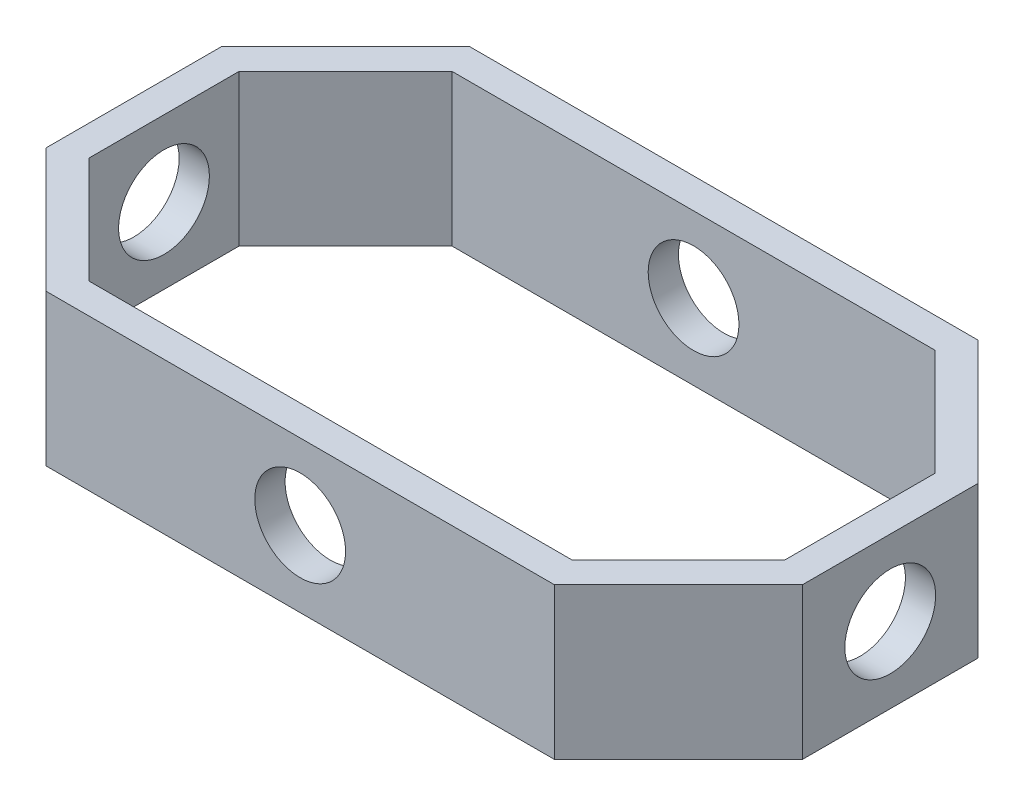
ISO-10303-21;
HEADER;
FILE_DESCRIPTION(('STEP AP214'),'2;1');
FILE_NAME('part.step','',(''),(''),'','','');
FILE_SCHEMA(('AUTOMOTIVE_DESIGN { 1 0 10303 214 1 1 1 1 }'));
ENDSEC;
DATA;
#1=APPLICATION_CONTEXT('core data for automotive mechanical design processes');
#2=APPLICATION_PROTOCOL_DEFINITION('international standard','automotive_design',2000,#1);
#3=PRODUCT_CONTEXT('',#1,'mechanical');
#4=PRODUCT('Part','Part','',(#3));
#5=PRODUCT_RELATED_PRODUCT_CATEGORY('part','',(#4));
#6=PRODUCT_DEFINITION_FORMATION('','',#4);
#7=PRODUCT_DEFINITION_CONTEXT('part definition',#1,'design');
#8=PRODUCT_DEFINITION('design','',#6,#7);
#9=PRODUCT_DEFINITION_SHAPE('','',#8);
#10=(LENGTH_UNIT() NAMED_UNIT(*) SI_UNIT(.MILLI.,.METRE.));
#11=(NAMED_UNIT(*) PLANE_ANGLE_UNIT() SI_UNIT($,.RADIAN.));
#12=(NAMED_UNIT(*) SI_UNIT($,.STERADIAN.) SOLID_ANGLE_UNIT());
#13=UNCERTAINTY_MEASURE_WITH_UNIT(LENGTH_MEASURE(1.E-05),#10,'distance_accuracy_value','');
#14=(GEOMETRIC_REPRESENTATION_CONTEXT(3) GLOBAL_UNCERTAINTY_ASSIGNED_CONTEXT((#13)) GLOBAL_UNIT_ASSIGNED_CONTEXT((#10,
#11,#12)) REPRESENTATION_CONTEXT('',''));
#15=CARTESIAN_POINT('',(0.,0.,0.));
#16=DIRECTION('',(0.,0.,1.));
#17=DIRECTION('',(1.,0.,0.));
#18=AXIS2_PLACEMENT_3D('',#15,#16,#17);
#19=CARTESIAN_POINT('',(0.,10.,0.));
#20=DIRECTION('',(0.,1.,0.));
#21=DIRECTION('',(0.,0.,1.));
#22=AXIS2_PLACEMENT_3D('',#19,#20,#21);
#23=PLANE('',#22);
#24=DIRECTION('',(-0.707106781186547,0.,0.707106781186548));
#25=VECTOR('',#24,1.);
#26=CARTESIAN_POINT('',(-16.7989898732233,10.,-14.));
#27=LINE('',#26,#25);
#28=CARTESIAN_POINT('',(-16.7989898732233,10.,-14.));
#29=VERTEX_POINT('',#28);
#30=CARTESIAN_POINT('',(-25.,10.,-5.79898987322331));
#31=VERTEX_POINT('',#30);
#32=EDGE_CURVE('E244',#29,#31,#27,.T.);
#33=ORIENTED_EDGE('',*,*,#32,.T.);
#34=DIRECTION('',(0.,0.,1.));
#35=VECTOR('',#34,1.);
#36=CARTESIAN_POINT('',(-25.,10.,-5.79898987322331));
#37=LINE('',#36,#35);
#38=CARTESIAN_POINT('',(-25.,10.,5.79898987322336));
#39=VERTEX_POINT('',#38);
#40=EDGE_CURVE('E248',#31,#39,#37,.T.);
#41=ORIENTED_EDGE('',*,*,#40,.T.);
#42=DIRECTION('',(0.707106781186548,0.,0.707106781186547));
#43=VECTOR('',#42,1.);
#44=CARTESIAN_POINT('',(-25.,10.,5.79898987322336));
#45=LINE('',#44,#43);
#46=CARTESIAN_POINT('',(-16.7989898732233,10.,14.));
#47=VERTEX_POINT('',#46);
#48=EDGE_CURVE('E252',#39,#47,#45,.T.);
#49=ORIENTED_EDGE('',*,*,#48,.T.);
#50=DIRECTION('',(1.,0.,0.));
#51=VECTOR('',#50,1.);
#52=CARTESIAN_POINT('',(-16.7989898732233,10.,14.));
#53=LINE('',#52,#51);
#54=CARTESIAN_POINT('',(16.7989898732233,10.,14.));
#55=VERTEX_POINT('',#54);
#56=EDGE_CURVE('E255',#47,#55,#53,.T.);
#57=ORIENTED_EDGE('',*,*,#56,.T.);
#58=DIRECTION('',(0.707106781186546,0.,-0.707106781186548));
#59=VECTOR('',#58,1.);
#60=CARTESIAN_POINT('',(16.7989898732233,10.,14.));
#61=LINE('',#60,#59);
#62=CARTESIAN_POINT('',(25.,10.,5.79898987322331));
#63=VERTEX_POINT('',#62);
#64=EDGE_CURVE('E258',#55,#63,#61,.T.);
#65=ORIENTED_EDGE('',*,*,#64,.T.);
#66=DIRECTION('',(0.,0.,-1.));
#67=VECTOR('',#66,1.);
#68=CARTESIAN_POINT('',(25.,10.,5.79898987322331));
#69=LINE('',#68,#67);
#70=CARTESIAN_POINT('',(25.,10.,-5.79898987322333));
#71=VERTEX_POINT('',#70);
#72=EDGE_CURVE('E261',#63,#71,#69,.T.);
#73=ORIENTED_EDGE('',*,*,#72,.T.);
#74=DIRECTION('',(-0.707106781186549,0.,-0.707106781186547));
#75=VECTOR('',#74,1.);
#76=CARTESIAN_POINT('',(25.,10.,-5.79898987322333));
#77=LINE('',#76,#75);
#78=CARTESIAN_POINT('',(16.7989898732233,10.,-14.));
#79=VERTEX_POINT('',#78);
#80=EDGE_CURVE('E264',#71,#79,#77,.T.);
#81=ORIENTED_EDGE('',*,*,#80,.T.);
#82=DIRECTION('',(-1.,0.,0.));
#83=VECTOR('',#82,1.);
#84=CARTESIAN_POINT('',(16.7989898732233,10.,-14.));
#85=LINE('',#84,#83);
#86=EDGE_CURVE('E267',#79,#29,#85,.T.);
#87=ORIENTED_EDGE('',*,*,#86,.T.);
#88=EDGE_LOOP('',(#33,#41,#49,#57,#65,#73,#81,#87));
#89=FACE_BOUND('',#88,.T.);
#90=DIRECTION('',(0.707106781186548,0.,0.707106781186548));
#91=VECTOR('',#90,1.);
#92=CARTESIAN_POINT('',(-23.,10.,4.97056274847715));
#93=LINE('',#92,#91);
#94=CARTESIAN_POINT('',(-23.,10.,4.97056274847715));
#95=VERTEX_POINT('',#94);
#96=CARTESIAN_POINT('',(-15.9705627484772,10.,12.));
#97=VERTEX_POINT('',#96);
#98=EDGE_CURVE('E162',#95,#97,#93,.T.);
#99=ORIENTED_EDGE('',*,*,#98,.F.);
#100=DIRECTION('',(0.,0.,1.));
#101=VECTOR('',#100,1.);
#102=CARTESIAN_POINT('',(-23.,10.,-4.97056274847714));
#103=LINE('',#102,#101);
#104=CARTESIAN_POINT('',(-23.,10.,-4.97056274847714));
#105=VERTEX_POINT('',#104);
#106=EDGE_CURVE('E153',#105,#95,#103,.T.);
#107=ORIENTED_EDGE('',*,*,#106,.F.);
#108=DIRECTION('',(-0.707106781186548,0.,0.707106781186548));
#109=VECTOR('',#108,1.);
#110=CARTESIAN_POINT('',(-15.9705627484771,10.,-12.));
#111=LINE('',#110,#109);
#112=CARTESIAN_POINT('',(-15.9705627484771,10.,-12.));
#113=VERTEX_POINT('',#112);
#114=EDGE_CURVE('E195',#113,#105,#111,.T.);
#115=ORIENTED_EDGE('',*,*,#114,.F.);
#116=DIRECTION('',(-1.,0.,0.));
#117=VECTOR('',#116,1.);
#118=CARTESIAN_POINT('',(15.9705627484771,10.,-12.));
#119=LINE('',#118,#117);
#120=CARTESIAN_POINT('',(15.9705627484771,10.,-12.));
#121=VERTEX_POINT('',#120);
#122=EDGE_CURVE('E192',#121,#113,#119,.T.);
#123=ORIENTED_EDGE('',*,*,#122,.F.);
#124=DIRECTION('',(-0.707106781186548,0.,-0.707106781186548));
#125=VECTOR('',#124,1.);
#126=CARTESIAN_POINT('',(23.,10.,-4.97056274847714));
#127=LINE('',#126,#125);
#128=CARTESIAN_POINT('',(23.,10.,-4.97056274847714));
#129=VERTEX_POINT('',#128);
#130=EDGE_CURVE('E189',#129,#121,#127,.T.);
#131=ORIENTED_EDGE('',*,*,#130,.F.);
#132=DIRECTION('',(0.,0.,-1.));
#133=VECTOR('',#132,1.);
#134=CARTESIAN_POINT('',(23.,10.,4.97056274847714));
#135=LINE('',#134,#133);
#136=CARTESIAN_POINT('',(23.,10.,4.97056274847714));
#137=VERTEX_POINT('',#136);
#138=EDGE_CURVE('E186',#137,#129,#135,.T.);
#139=ORIENTED_EDGE('',*,*,#138,.F.);
#140=DIRECTION('',(0.707106781186548,0.,-0.707106781186548));
#141=VECTOR('',#140,1.);
#142=CARTESIAN_POINT('',(15.9705627484771,10.,12.));
#143=LINE('',#142,#141);
#144=CARTESIAN_POINT('',(15.9705627484771,10.,12.));
#145=VERTEX_POINT('',#144);
#146=EDGE_CURVE('E180',#145,#137,#143,.T.);
#147=ORIENTED_EDGE('',*,*,#146,.F.);
#148=DIRECTION('',(1.,0.,0.));
#149=VECTOR('',#148,1.);
#150=CARTESIAN_POINT('',(-15.9705627484772,10.,12.));
#151=LINE('',#150,#149);
#152=EDGE_CURVE('E176',#97,#145,#151,.T.);
#153=ORIENTED_EDGE('',*,*,#152,.F.);
#154=EDGE_LOOP('',(#99,#107,#115,#123,#131,#139,#147,#153));
#155=FACE_BOUND('',#154,.T.);
#156=ADVANCED_FACE('F39',(#89,#155),#23,.T.);
#157=CARTESIAN_POINT('',(0.,0.,0.));
#158=DIRECTION('',(0.,1.,0.));
#159=DIRECTION('',(0.,0.,1.));
#160=AXIS2_PLACEMENT_3D('',#157,#158,#159);
#161=PLANE('',#160);
#162=DIRECTION('',(-0.707106781186547,0.,0.707106781186548));
#163=VECTOR('',#162,1.);
#164=CARTESIAN_POINT('',(-16.7989898732233,0.,-14.));
#165=LINE('',#164,#163);
#166=CARTESIAN_POINT('',(-16.7989898732233,0.,-14.));
#167=VERTEX_POINT('',#166);
#168=CARTESIAN_POINT('',(-25.,0.,-5.79898987322331));
#169=VERTEX_POINT('',#168);
#170=EDGE_CURVE('E171',#167,#169,#165,.T.);
#171=ORIENTED_EDGE('',*,*,#170,.F.);
#172=DIRECTION('',(-1.,0.,0.));
#173=VECTOR('',#172,1.);
#174=CARTESIAN_POINT('',(16.7989898732233,0.,-14.));
#175=LINE('',#174,#173);
#176=CARTESIAN_POINT('',(16.7989898732233,0.,-14.));
#177=VERTEX_POINT('',#176);
#178=EDGE_CURVE('E249',#177,#167,#175,.T.);
#179=ORIENTED_EDGE('',*,*,#178,.F.);
#180=DIRECTION('',(-0.707106781186549,0.,-0.707106781186547));
#181=VECTOR('',#180,1.);
#182=CARTESIAN_POINT('',(25.,0.,-5.79898987322333));
#183=LINE('',#182,#181);
#184=CARTESIAN_POINT('',(25.,0.,-5.79898987322333));
#185=VERTEX_POINT('',#184);
#186=EDGE_CURVE('E289',#185,#177,#183,.T.);
#187=ORIENTED_EDGE('',*,*,#186,.F.);
#188=DIRECTION('',(0.,0.,-1.));
#189=VECTOR('',#188,1.);
#190=CARTESIAN_POINT('',(25.,0.,5.79898987322331));
#191=LINE('',#190,#189);
#192=CARTESIAN_POINT('',(25.,0.,5.79898987322331));
#193=VERTEX_POINT('',#192);
#194=EDGE_CURVE('E286',#193,#185,#191,.T.);
#195=ORIENTED_EDGE('',*,*,#194,.F.);
#196=DIRECTION('',(0.707106781186546,0.,-0.707106781186548));
#197=VECTOR('',#196,1.);
#198=CARTESIAN_POINT('',(16.7989898732233,0.,14.));
#199=LINE('',#198,#197);
#200=CARTESIAN_POINT('',(16.7989898732233,0.,14.));
#201=VERTEX_POINT('',#200);
#202=EDGE_CURVE('E283',#201,#193,#199,.T.);
#203=ORIENTED_EDGE('',*,*,#202,.F.);
#204=DIRECTION('',(1.,0.,0.));
#205=VECTOR('',#204,1.);
#206=CARTESIAN_POINT('',(-16.7989898732233,0.,14.));
#207=LINE('',#206,#205);
#208=CARTESIAN_POINT('',(-16.7989898732233,0.,14.));
#209=VERTEX_POINT('',#208);
#210=EDGE_CURVE('E280',#209,#201,#207,.T.);
#211=ORIENTED_EDGE('',*,*,#210,.F.);
#212=DIRECTION('',(0.707106781186548,0.,0.707106781186547));
#213=VECTOR('',#212,1.);
#214=CARTESIAN_POINT('',(-25.,0.,5.79898987322336));
#215=LINE('',#214,#213);
#216=CARTESIAN_POINT('',(-25.,0.,5.79898987322336));
#217=VERTEX_POINT('',#216);
#218=EDGE_CURVE('E277',#217,#209,#215,.T.);
#219=ORIENTED_EDGE('',*,*,#218,.F.);
#220=DIRECTION('',(0.,0.,1.));
#221=VECTOR('',#220,1.);
#222=CARTESIAN_POINT('',(-25.,0.,-5.79898987322331));
#223=LINE('',#222,#221);
#224=EDGE_CURVE('E274',#169,#217,#223,.T.);
#225=ORIENTED_EDGE('',*,*,#224,.F.);
#226=EDGE_LOOP('',(#171,#179,#187,#195,#203,#211,#219,#225));
#227=FACE_BOUND('',#226,.T.);
#228=DIRECTION('',(0.,0.,1.));
#229=VECTOR('',#228,1.);
#230=CARTESIAN_POINT('',(-23.,0.,-4.97056274847714));
#231=LINE('',#230,#229);
#232=CARTESIAN_POINT('',(-23.,0.,-4.97056274847714));
#233=VERTEX_POINT('',#232);
#234=CARTESIAN_POINT('',(-23.,0.,4.97056274847715));
#235=VERTEX_POINT('',#234);
#236=EDGE_CURVE('E63',#233,#235,#231,.T.);
#237=ORIENTED_EDGE('',*,*,#236,.T.);
#238=DIRECTION('',(0.707106781186548,0.,0.707106781186548));
#239=VECTOR('',#238,1.);
#240=CARTESIAN_POINT('',(-23.,0.,4.97056274847715));
#241=LINE('',#240,#239);
#242=CARTESIAN_POINT('',(-15.9705627484772,0.,12.));
#243=VERTEX_POINT('',#242);
#244=EDGE_CURVE('E169',#235,#243,#241,.T.);
#245=ORIENTED_EDGE('',*,*,#244,.T.);
#246=DIRECTION('',(1.,0.,0.));
#247=VECTOR('',#246,1.);
#248=CARTESIAN_POINT('',(-15.9705627484772,0.,12.));
#249=LINE('',#248,#247);
#250=CARTESIAN_POINT('',(15.9705627484771,0.,12.));
#251=VERTEX_POINT('',#250);
#252=EDGE_CURVE('E203',#243,#251,#249,.T.);
#253=ORIENTED_EDGE('',*,*,#252,.T.);
#254=DIRECTION('',(0.707106781186548,0.,-0.707106781186548));
#255=VECTOR('',#254,1.);
#256=CARTESIAN_POINT('',(15.9705627484771,0.,12.));
#257=LINE('',#256,#255);
#258=CARTESIAN_POINT('',(23.,0.,4.97056274847714));
#259=VERTEX_POINT('',#258);
#260=EDGE_CURVE('E207',#251,#259,#257,.T.);
#261=ORIENTED_EDGE('',*,*,#260,.T.);
#262=DIRECTION('',(0.,0.,-1.));
#263=VECTOR('',#262,1.);
#264=CARTESIAN_POINT('',(23.,0.,4.97056274847714));
#265=LINE('',#264,#263);
#266=CARTESIAN_POINT('',(23.,0.,-4.97056274847714));
#267=VERTEX_POINT('',#266);
#268=EDGE_CURVE('E211',#259,#267,#265,.T.);
#269=ORIENTED_EDGE('',*,*,#268,.T.);
#270=DIRECTION('',(-0.707106781186548,0.,-0.707106781186548));
#271=VECTOR('',#270,1.);
#272=CARTESIAN_POINT('',(23.,0.,-4.97056274847714));
#273=LINE('',#272,#271);
#274=CARTESIAN_POINT('',(15.9705627484771,0.,-12.));
#275=VERTEX_POINT('',#274);
#276=EDGE_CURVE('E215',#267,#275,#273,.T.);
#277=ORIENTED_EDGE('',*,*,#276,.T.);
#278=DIRECTION('',(-1.,0.,0.));
#279=VECTOR('',#278,1.);
#280=CARTESIAN_POINT('',(15.9705627484771,0.,-12.));
#281=LINE('',#280,#279);
#282=CARTESIAN_POINT('',(-15.9705627484771,0.,-12.));
#283=VERTEX_POINT('',#282);
#284=EDGE_CURVE('E219',#275,#283,#281,.T.);
#285=ORIENTED_EDGE('',*,*,#284,.T.);
#286=DIRECTION('',(-0.707106781186548,0.,0.707106781186548));
#287=VECTOR('',#286,1.);
#288=CARTESIAN_POINT('',(-15.9705627484771,0.,-12.));
#289=LINE('',#288,#287);
#290=EDGE_CURVE('E163',#283,#233,#289,.T.);
#291=ORIENTED_EDGE('',*,*,#290,.T.);
#292=EDGE_LOOP('',(#237,#245,#253,#261,#269,#277,#285,#291));
#293=FACE_BOUND('',#292,.T.);
#294=ADVANCED_FACE('F328',(#227,#293),#161,.F.);
#295=CARTESIAN_POINT('',(-16.7989898732233,10.,-14.));
#296=DIRECTION('',(0.707106781186548,0.,0.707106781186547));
#297=DIRECTION('',(0.707106781186547,0.,-0.707106781186548));
#298=AXIS2_PLACEMENT_3D('',#295,#296,#297);
#299=PLANE('',#298);
#300=ORIENTED_EDGE('',*,*,#170,.T.);
#301=DIRECTION('',(0.,-1.,0.));
#302=VECTOR('',#301,1.);
#303=CARTESIAN_POINT('',(-25.,10.,-5.79898987322331));
#304=LINE('',#303,#302);
#305=EDGE_CURVE('E11',#31,#169,#304,.T.);
#306=ORIENTED_EDGE('',*,*,#305,.F.);
#307=ORIENTED_EDGE('',*,*,#32,.F.);
#308=DIRECTION('',(0.,-1.,0.));
#309=VECTOR('',#308,1.);
#310=CARTESIAN_POINT('',(-16.7989898732233,10.,-14.));
#311=LINE('',#310,#309);
#312=EDGE_CURVE('E270',#29,#167,#311,.T.);
#313=ORIENTED_EDGE('',*,*,#312,.T.);
#314=EDGE_LOOP('',(#300,#306,#307,#313));
#315=FACE_BOUND('',#314,.T.);
#316=ADVANCED_FACE('F41',(#315),#299,.F.);
#317=CARTESIAN_POINT('',(-25.,10.,-5.79898987322331));
#318=DIRECTION('',(1.,0.,0.));
#319=DIRECTION('',(0.,0.,-1.));
#320=AXIS2_PLACEMENT_3D('',#317,#318,#319);
#321=PLANE('',#320);
#322=CARTESIAN_POINT('',(-25.,5.,0.));
#323=DIRECTION('',(1.,0.,0.));
#324=DIRECTION('',(0.,0.,-1.));
#325=AXIS2_PLACEMENT_3D('',#322,#323,#324);
#326=CIRCLE('',#325,3.);
#327=CARTESIAN_POINT('',(-25.,5.,-2.99999999999991));
#328=VERTEX_POINT('',#327);
#329=EDGE_CURVE('E395',#328,#328,#326,.F.);
#330=ORIENTED_EDGE('',*,*,#329,.F.);
#331=EDGE_LOOP('',(#330));
#332=FACE_BOUND('',#331,.T.);
#333=ORIENTED_EDGE('',*,*,#224,.T.);
#334=DIRECTION('',(0.,-1.,0.));
#335=VECTOR('',#334,1.);
#336=CARTESIAN_POINT('',(-25.,10.,5.79898987322336));
#337=LINE('',#336,#335);
#338=EDGE_CURVE('E48',#39,#217,#337,.T.);
#339=ORIENTED_EDGE('',*,*,#338,.F.);
#340=ORIENTED_EDGE('',*,*,#40,.F.);
#341=ORIENTED_EDGE('',*,*,#305,.T.);
#342=EDGE_LOOP('',(#333,#339,#340,#341));
#343=FACE_BOUND('',#342,.T.);
#344=ADVANCED_FACE('F345',(#332,#343),#321,.F.);
#345=CARTESIAN_POINT('',(-25.,10.,5.79898987322336));
#346=DIRECTION('',(0.707106781186547,0.,-0.707106781186548));
#347=DIRECTION('',(-0.707106781186548,0.,-0.707106781186547));
#348=AXIS2_PLACEMENT_3D('',#345,#346,#347);
#349=PLANE('',#348);
#350=ORIENTED_EDGE('',*,*,#218,.T.);
#351=DIRECTION('',(0.,-1.,0.));
#352=VECTOR('',#351,1.);
#353=CARTESIAN_POINT('',(-16.7989898732233,10.,14.));
#354=LINE('',#353,#352);
#355=EDGE_CURVE('E313',#47,#209,#354,.T.);
#356=ORIENTED_EDGE('',*,*,#355,.F.);
#357=ORIENTED_EDGE('',*,*,#48,.F.);
#358=ORIENTED_EDGE('',*,*,#338,.T.);
#359=EDGE_LOOP('',(#350,#356,#357,#358));
#360=FACE_BOUND('',#359,.T.);
#361=ADVANCED_FACE('F322',(#360),#349,.F.);
#362=CARTESIAN_POINT('',(-16.7989898732233,10.,14.));
#363=DIRECTION('',(0.,0.,-1.));
#364=DIRECTION('',(-1.,0.,0.));
#365=AXIS2_PLACEMENT_3D('',#362,#363,#364);
#366=PLANE('',#365);
#367=CARTESIAN_POINT('',(0.,5.,14.));
#368=DIRECTION('',(0.,0.,1.));
#369=DIRECTION('',(1.,0.,0.));
#370=AXIS2_PLACEMENT_3D('',#367,#368,#369);
#371=CIRCLE('',#370,3.);
#372=CARTESIAN_POINT('',(3.,5.,14.));
#373=VERTEX_POINT('',#372);
#374=EDGE_CURVE('E200',#373,#373,#371,.T.);
#375=ORIENTED_EDGE('',*,*,#374,.F.);
#376=EDGE_LOOP('',(#375));
#377=FACE_BOUND('',#376,.T.);
#378=ORIENTED_EDGE('',*,*,#210,.T.);
#379=DIRECTION('',(0.,-1.,0.));
#380=VECTOR('',#379,1.);
#381=CARTESIAN_POINT('',(16.7989898732233,10.,14.));
#382=LINE('',#381,#380);
#383=EDGE_CURVE('E309',#55,#201,#382,.T.);
#384=ORIENTED_EDGE('',*,*,#383,.F.);
#385=ORIENTED_EDGE('',*,*,#56,.F.);
#386=ORIENTED_EDGE('',*,*,#355,.T.);
#387=EDGE_LOOP('',(#378,#384,#385,#386));
#388=FACE_BOUND('',#387,.T.);
#389=ADVANCED_FACE('F334',(#377,#388),#366,.F.);
#390=CARTESIAN_POINT('',(16.7989898732233,10.,14.));
#391=DIRECTION('',(-0.707106781186548,0.,-0.707106781186546));
#392=DIRECTION('',(-0.707106781186547,0.,0.707106781186549));
#393=AXIS2_PLACEMENT_3D('',#390,#391,#392);
#394=PLANE('',#393);
#395=ORIENTED_EDGE('',*,*,#202,.T.);
#396=DIRECTION('',(0.,-1.,0.));
#397=VECTOR('',#396,1.);
#398=CARTESIAN_POINT('',(25.,10.,5.79898987322331));
#399=LINE('',#398,#397);
#400=EDGE_CURVE('E305',#63,#193,#399,.T.);
#401=ORIENTED_EDGE('',*,*,#400,.F.);
#402=ORIENTED_EDGE('',*,*,#64,.F.);
#403=ORIENTED_EDGE('',*,*,#383,.T.);
#404=EDGE_LOOP('',(#395,#401,#402,#403));
#405=FACE_BOUND('',#404,.T.);
#406=ADVANCED_FACE('F338',(#405),#394,.F.);
#407=CARTESIAN_POINT('',(25.,10.,5.79898987322331));
#408=DIRECTION('',(-1.,0.,0.));
#409=DIRECTION('',(0.,0.,1.));
#410=AXIS2_PLACEMENT_3D('',#407,#408,#409);
#411=PLANE('',#410);
#412=CARTESIAN_POINT('',(25.,5.,-2.61861100413235E-13));
#413=DIRECTION('',(-1.,0.,0.));
#414=DIRECTION('',(0.,0.,1.));
#415=AXIS2_PLACEMENT_3D('',#412,#413,#414);
#416=CIRCLE('',#415,3.);
#417=CARTESIAN_POINT('',(25.,5.,2.99999999999974));
#418=VERTEX_POINT('',#417);
#419=EDGE_CURVE('E398',#418,#418,#416,.F.);
#420=ORIENTED_EDGE('',*,*,#419,.F.);
#421=EDGE_LOOP('',(#420));
#422=FACE_BOUND('',#421,.T.);
#423=ORIENTED_EDGE('',*,*,#194,.T.);
#424=DIRECTION('',(0.,-1.,0.));
#425=VECTOR('',#424,1.);
#426=CARTESIAN_POINT('',(25.,10.,-5.79898987322333));
#427=LINE('',#426,#425);
#428=EDGE_CURVE('E301',#71,#185,#427,.T.);
#429=ORIENTED_EDGE('',*,*,#428,.F.);
#430=ORIENTED_EDGE('',*,*,#72,.F.);
#431=ORIENTED_EDGE('',*,*,#400,.T.);
#432=EDGE_LOOP('',(#423,#429,#430,#431));
#433=FACE_BOUND('',#432,.T.);
#434=ADVANCED_FACE('F358',(#422,#433),#411,.F.);
#435=CARTESIAN_POINT('',(25.,10.,-5.79898987322333));
#436=DIRECTION('',(-0.707106781186547,0.,0.707106781186548));
#437=DIRECTION('',(0.707106781186548,0.,0.707106781186547));
#438=AXIS2_PLACEMENT_3D('',#435,#436,#437);
#439=PLANE('',#438);
#440=ORIENTED_EDGE('',*,*,#186,.T.);
#441=DIRECTION('',(0.,-1.,0.));
#442=VECTOR('',#441,1.);
#443=CARTESIAN_POINT('',(16.7989898732233,10.,-14.));
#444=LINE('',#443,#442);
#445=EDGE_CURVE('E297',#79,#177,#444,.T.);
#446=ORIENTED_EDGE('',*,*,#445,.F.);
#447=ORIENTED_EDGE('',*,*,#80,.F.);
#448=ORIENTED_EDGE('',*,*,#428,.T.);
#449=EDGE_LOOP('',(#440,#446,#447,#448));
#450=FACE_BOUND('',#449,.T.);
#451=ADVANCED_FACE('F356',(#450),#439,.F.);
#452=CARTESIAN_POINT('',(16.7989898732233,10.,-14.));
#453=DIRECTION('',(0.,0.,1.));
#454=DIRECTION('',(1.,0.,0.));
#455=AXIS2_PLACEMENT_3D('',#452,#453,#454);
#456=PLANE('',#455);
#457=CARTESIAN_POINT('',(0.,5.,-14.));
#458=DIRECTION('',(0.,0.,-1.));
#459=DIRECTION('',(-1.,0.,0.));
#460=AXIS2_PLACEMENT_3D('',#457,#458,#459);
#461=CIRCLE('',#460,3.);
#462=CARTESIAN_POINT('',(-3.,5.,-14.));
#463=VERTEX_POINT('',#462);
#464=EDGE_CURVE('E386',#463,#463,#461,.T.);
#465=ORIENTED_EDGE('',*,*,#464,.F.);
#466=EDGE_LOOP('',(#465));
#467=FACE_BOUND('',#466,.T.);
#468=ORIENTED_EDGE('',*,*,#178,.T.);
#469=ORIENTED_EDGE('',*,*,#312,.F.);
#470=ORIENTED_EDGE('',*,*,#86,.F.);
#471=ORIENTED_EDGE('',*,*,#445,.T.);
#472=EDGE_LOOP('',(#468,#469,#470,#471));
#473=FACE_BOUND('',#472,.T.);
#474=ADVANCED_FACE('F351',(#467,#473),#456,.F.);
#475=CARTESIAN_POINT('',(-23.,10.,-4.97056274847714));
#476=DIRECTION('',(1.,0.,0.));
#477=DIRECTION('',(0.,0.,-1.));
#478=AXIS2_PLACEMENT_3D('',#475,#476,#477);
#479=PLANE('',#478);
#480=CARTESIAN_POINT('',(-23.,5.,0.));
#481=DIRECTION('',(1.,0.,0.));
#482=DIRECTION('',(0.,0.,-1.));
#483=AXIS2_PLACEMENT_3D('',#480,#481,#482);
#484=CIRCLE('',#483,3.);
#485=CARTESIAN_POINT('',(-23.,5.,-2.99999999999992));
#486=VERTEX_POINT('',#485);
#487=EDGE_CURVE('E389',#486,#486,#484,.F.);
#488=ORIENTED_EDGE('',*,*,#487,.T.);
#489=EDGE_LOOP('',(#488));
#490=FACE_BOUND('',#489,.T.);
#491=ORIENTED_EDGE('',*,*,#236,.F.);
#492=DIRECTION('',(0.,-1.,0.));
#493=VECTOR('',#492,1.);
#494=CARTESIAN_POINT('',(-23.,10.,-4.97056274847714));
#495=LINE('',#494,#493);
#496=EDGE_CURVE('E157',#105,#233,#495,.T.);
#497=ORIENTED_EDGE('',*,*,#496,.F.);
#498=ORIENTED_EDGE('',*,*,#106,.T.);
#499=DIRECTION('',(0.,-1.,0.));
#500=VECTOR('',#499,1.);
#501=CARTESIAN_POINT('',(-23.,10.,4.97056274847715));
#502=LINE('',#501,#500);
#503=EDGE_CURVE('E156',#95,#235,#502,.T.);
#504=ORIENTED_EDGE('',*,*,#503,.T.);
#505=EDGE_LOOP('',(#491,#497,#498,#504));
#506=FACE_BOUND('',#505,.T.);
#507=ADVANCED_FACE('F155',(#490,#506),#479,.T.);
#508=CARTESIAN_POINT('',(-23.,10.,4.97056274847715));
#509=DIRECTION('',(0.707106781186548,0.,-0.707106781186548));
#510=DIRECTION('',(-0.707106781186548,0.,-0.707106781186548));
#511=AXIS2_PLACEMENT_3D('',#508,#509,#510);
#512=PLANE('',#511);
#513=ORIENTED_EDGE('',*,*,#244,.F.);
#514=ORIENTED_EDGE('',*,*,#503,.F.);
#515=ORIENTED_EDGE('',*,*,#98,.T.);
#516=DIRECTION('',(0.,-1.,0.));
#517=VECTOR('',#516,1.);
#518=CARTESIAN_POINT('',(-15.9705627484772,10.,12.));
#519=LINE('',#518,#517);
#520=EDGE_CURVE('E172',#97,#243,#519,.T.);
#521=ORIENTED_EDGE('',*,*,#520,.T.);
#522=EDGE_LOOP('',(#513,#514,#515,#521));
#523=FACE_BOUND('',#522,.T.);
#524=ADVANCED_FACE('F166',(#523),#512,.T.);
#525=CARTESIAN_POINT('',(-15.9705627484772,10.,12.));
#526=DIRECTION('',(0.,0.,-1.));
#527=DIRECTION('',(-1.,0.,0.));
#528=AXIS2_PLACEMENT_3D('',#525,#526,#527);
#529=PLANE('',#528);
#530=CARTESIAN_POINT('',(0.,5.,12.));
#531=DIRECTION('',(0.,0.,-1.));
#532=DIRECTION('',(-1.,0.,0.));
#533=AXIS2_PLACEMENT_3D('',#530,#531,#532);
#534=CIRCLE('',#533,3.);
#535=CARTESIAN_POINT('',(-3.,5.,12.));
#536=VERTEX_POINT('',#535);
#537=EDGE_CURVE('E409',#536,#536,#534,.F.);
#538=ORIENTED_EDGE('',*,*,#537,.T.);
#539=EDGE_LOOP('',(#538));
#540=FACE_BOUND('',#539,.T.);
#541=ORIENTED_EDGE('',*,*,#252,.F.);
#542=ORIENTED_EDGE('',*,*,#520,.F.);
#543=ORIENTED_EDGE('',*,*,#152,.T.);
#544=DIRECTION('',(0.,-1.,0.));
#545=VECTOR('',#544,1.);
#546=CARTESIAN_POINT('',(15.9705627484771,10.,12.));
#547=LINE('',#546,#545);
#548=EDGE_CURVE('E239',#145,#251,#547,.T.);
#549=ORIENTED_EDGE('',*,*,#548,.T.);
#550=EDGE_LOOP('',(#541,#542,#543,#549));
#551=FACE_BOUND('',#550,.T.);
#552=ADVANCED_FACE('F470',(#540,#551),#529,.T.);
#553=CARTESIAN_POINT('',(15.9705627484771,10.,12.));
#554=DIRECTION('',(-0.707106781186548,0.,-0.707106781186548));
#555=DIRECTION('',(-0.707106781186548,0.,0.707106781186548));
#556=AXIS2_PLACEMENT_3D('',#553,#554,#555);
#557=PLANE('',#556);
#558=ORIENTED_EDGE('',*,*,#260,.F.);
#559=ORIENTED_EDGE('',*,*,#548,.F.);
#560=ORIENTED_EDGE('',*,*,#146,.T.);
#561=DIRECTION('',(0.,-1.,0.));
#562=VECTOR('',#561,1.);
#563=CARTESIAN_POINT('',(23.,10.,4.97056274847714));
#564=LINE('',#563,#562);
#565=EDGE_CURVE('E236',#137,#259,#564,.T.);
#566=ORIENTED_EDGE('',*,*,#565,.T.);
#567=EDGE_LOOP('',(#558,#559,#560,#566));
#568=FACE_BOUND('',#567,.T.);
#569=ADVANCED_FACE('F466',(#568),#557,.T.);
#570=CARTESIAN_POINT('',(23.,10.,4.97056274847714));
#571=DIRECTION('',(-1.,0.,0.));
#572=DIRECTION('',(0.,0.,1.));
#573=AXIS2_PLACEMENT_3D('',#570,#571,#572);
#574=PLANE('',#573);
#575=CARTESIAN_POINT('',(23.,5.,-2.40912212380176E-13));
#576=DIRECTION('',(-1.,0.,0.));
#577=DIRECTION('',(0.,0.,1.));
#578=AXIS2_PLACEMENT_3D('',#575,#576,#577);
#579=CIRCLE('',#578,3.);
#580=CARTESIAN_POINT('',(23.,5.,2.99999999999976));
#581=VERTEX_POINT('',#580);
#582=EDGE_CURVE('E402',#581,#581,#579,.F.);
#583=ORIENTED_EDGE('',*,*,#582,.T.);
#584=EDGE_LOOP('',(#583));
#585=FACE_BOUND('',#584,.T.);
#586=ORIENTED_EDGE('',*,*,#268,.F.);
#587=ORIENTED_EDGE('',*,*,#565,.F.);
#588=ORIENTED_EDGE('',*,*,#138,.T.);
#589=DIRECTION('',(0.,-1.,0.));
#590=VECTOR('',#589,1.);
#591=CARTESIAN_POINT('',(23.,10.,-4.97056274847714));
#592=LINE('',#591,#590);
#593=EDGE_CURVE('E233',#129,#267,#592,.T.);
#594=ORIENTED_EDGE('',*,*,#593,.T.);
#595=EDGE_LOOP('',(#586,#587,#588,#594));
#596=FACE_BOUND('',#595,.T.);
#597=ADVANCED_FACE('F462',(#585,#596),#574,.T.);
#598=CARTESIAN_POINT('',(23.,10.,-4.97056274847714));
#599=DIRECTION('',(-0.707106781186548,0.,0.707106781186548));
#600=DIRECTION('',(0.707106781186548,0.,0.707106781186548));
#601=AXIS2_PLACEMENT_3D('',#598,#599,#600);
#602=PLANE('',#601);
#603=ORIENTED_EDGE('',*,*,#276,.F.);
#604=ORIENTED_EDGE('',*,*,#593,.F.);
#605=ORIENTED_EDGE('',*,*,#130,.T.);
#606=DIRECTION('',(0.,-1.,0.));
#607=VECTOR('',#606,1.);
#608=CARTESIAN_POINT('',(15.9705627484771,10.,-12.));
#609=LINE('',#608,#607);
#610=EDGE_CURVE('E230',#121,#275,#609,.T.);
#611=ORIENTED_EDGE('',*,*,#610,.T.);
#612=EDGE_LOOP('',(#603,#604,#605,#611));
#613=FACE_BOUND('',#612,.T.);
#614=ADVANCED_FACE('F458',(#613),#602,.T.);
#615=CARTESIAN_POINT('',(15.9705627484771,10.,-12.));
#616=DIRECTION('',(0.,0.,1.));
#617=DIRECTION('',(1.,0.,0.));
#618=AXIS2_PLACEMENT_3D('',#615,#616,#617);
#619=PLANE('',#618);
#620=CARTESIAN_POINT('',(0.,5.,-12.));
#621=DIRECTION('',(0.,0.,1.));
#622=DIRECTION('',(1.,0.,0.));
#623=AXIS2_PLACEMENT_3D('',#620,#621,#622);
#624=CIRCLE('',#623,3.);
#625=CARTESIAN_POINT('',(3.,5.,-12.));
#626=VERTEX_POINT('',#625);
#627=EDGE_CURVE('E390',#626,#626,#624,.F.);
#628=ORIENTED_EDGE('',*,*,#627,.T.);
#629=EDGE_LOOP('',(#628));
#630=FACE_BOUND('',#629,.T.);
#631=ORIENTED_EDGE('',*,*,#284,.F.);
#632=ORIENTED_EDGE('',*,*,#610,.F.);
#633=ORIENTED_EDGE('',*,*,#122,.T.);
#634=DIRECTION('',(0.,-1.,0.));
#635=VECTOR('',#634,1.);
#636=CARTESIAN_POINT('',(-15.9705627484771,10.,-12.));
#637=LINE('',#636,#635);
#638=EDGE_CURVE('E55',#113,#283,#637,.T.);
#639=ORIENTED_EDGE('',*,*,#638,.T.);
#640=EDGE_LOOP('',(#631,#632,#633,#639));
#641=FACE_BOUND('',#640,.T.);
#642=ADVANCED_FACE('F455',(#630,#641),#619,.T.);
#643=CARTESIAN_POINT('',(-15.9705627484771,10.,-12.));
#644=DIRECTION('',(0.707106781186548,0.,0.707106781186548));
#645=DIRECTION('',(0.707106781186548,0.,-0.707106781186548));
#646=AXIS2_PLACEMENT_3D('',#643,#644,#645);
#647=PLANE('',#646);
#648=ORIENTED_EDGE('',*,*,#290,.F.);
#649=ORIENTED_EDGE('',*,*,#638,.F.);
#650=ORIENTED_EDGE('',*,*,#114,.T.);
#651=ORIENTED_EDGE('',*,*,#496,.T.);
#652=EDGE_LOOP('',(#648,#649,#650,#651));
#653=FACE_BOUND('',#652,.T.);
#654=ADVANCED_FACE('F451',(#653),#647,.T.);
#655=CARTESIAN_POINT('',(0.,5.,-14.001));
#656=DIRECTION('',(0.,0.,1.));
#657=DIRECTION('',(1.,0.,0.));
#658=AXIS2_PLACEMENT_3D('',#655,#656,#657);
#659=CYLINDRICAL_SURFACE('',#658,3.);
#660=ORIENTED_EDGE('',*,*,#537,.F.);
#661=EDGE_LOOP('',(#660));
#662=FACE_BOUND('',#661,.T.);
#663=ORIENTED_EDGE('',*,*,#374,.T.);
#664=EDGE_LOOP('',(#663));
#665=FACE_BOUND('',#664,.T.);
#666=ADVANCED_FACE('F416',(#662,#665),#659,.F.);
#667=CARTESIAN_POINT('',(0.,5.,14.001));
#668=DIRECTION('',(0.,0.,-1.));
#669=DIRECTION('',(-1.,0.,0.));
#670=AXIS2_PLACEMENT_3D('',#667,#668,#669);
#671=CYLINDRICAL_SURFACE('',#670,3.);
#672=ORIENTED_EDGE('',*,*,#627,.F.);
#673=EDGE_LOOP('',(#672));
#674=FACE_BOUND('',#673,.T.);
#675=ORIENTED_EDGE('',*,*,#464,.T.);
#676=EDGE_LOOP('',(#675));
#677=FACE_BOUND('',#676,.T.);
#678=ADVANCED_FACE('F441',(#674,#677),#671,.F.);
#679=CARTESIAN_POINT('',(25.0010000000001,5.,-2.61871574857253E-13));
#680=DIRECTION('',(-1.,0.,0.));
#681=DIRECTION('',(0.,0.,1.));
#682=AXIS2_PLACEMENT_3D('',#679,#680,#681);
#683=CYLINDRICAL_SURFACE('',#682,3.);
#684=ORIENTED_EDGE('',*,*,#582,.F.);
#685=EDGE_LOOP('',(#684));
#686=FACE_BOUND('',#685,.T.);
#687=ORIENTED_EDGE('',*,*,#419,.T.);
#688=EDGE_LOOP('',(#687));
#689=FACE_BOUND('',#688,.T.);
#690=ADVANCED_FACE('F435',(#686,#689),#683,.F.);
#691=CARTESIAN_POINT('',(-25.0010000000001,5.,0.));
#692=DIRECTION('',(1.,0.,0.));
#693=DIRECTION('',(0.,0.,-1.));
#694=AXIS2_PLACEMENT_3D('',#691,#692,#693);
#695=CYLINDRICAL_SURFACE('',#694,3.);
#696=ORIENTED_EDGE('',*,*,#487,.F.);
#697=EDGE_LOOP('',(#696));
#698=FACE_BOUND('',#697,.T.);
#699=ORIENTED_EDGE('',*,*,#329,.T.);
#700=EDGE_LOOP('',(#699));
#701=FACE_BOUND('',#700,.T.);
#702=ADVANCED_FACE('F433',(#698,#701),#695,.F.);
#703=CLOSED_SHELL('',(#156,#294,#316,#344,#361,#389,#406,#434,#451,#474,#507,#524,#552,#569,
#597,#614,#642,#654,#666,#678,#690,#702));
#704=MANIFOLD_SOLID_BREP('B2',#703);
#705=ADVANCED_BREP_SHAPE_REPRESENTATION('',(#18,#704),#14);
#706=SHAPE_DEFINITION_REPRESENTATION(#9,#705);
ENDSEC;
END-ISO-10303-21;
